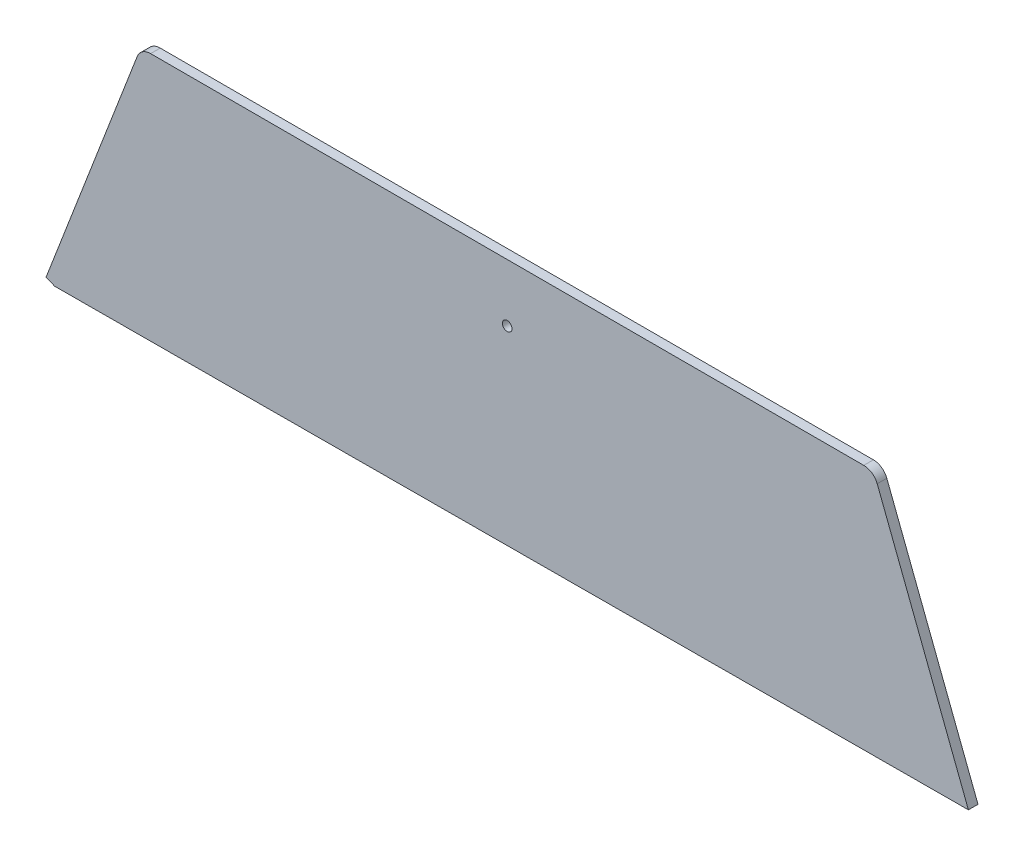
ISO-10303-21;
HEADER;
FILE_DESCRIPTION(('STEP AP214'),'2;1');
FILE_NAME('part.step','',(''),(''),'','','');
FILE_SCHEMA(('AUTOMOTIVE_DESIGN { 1 0 10303 214 1 1 1 1 }'));
ENDSEC;
DATA;
#1=APPLICATION_CONTEXT('core data for automotive mechanical design processes');
#2=APPLICATION_PROTOCOL_DEFINITION('international standard','automotive_design',2000,#1);
#3=PRODUCT_CONTEXT('',#1,'mechanical');
#4=PRODUCT('Part','Part','',(#3));
#5=PRODUCT_RELATED_PRODUCT_CATEGORY('part','',(#4));
#6=PRODUCT_DEFINITION_FORMATION('','',#4);
#7=PRODUCT_DEFINITION_CONTEXT('part definition',#1,'design');
#8=PRODUCT_DEFINITION('design','',#6,#7);
#9=PRODUCT_DEFINITION_SHAPE('','',#8);
#10=(LENGTH_UNIT() NAMED_UNIT(*) SI_UNIT(.MILLI.,.METRE.));
#11=(NAMED_UNIT(*) PLANE_ANGLE_UNIT() SI_UNIT($,.RADIAN.));
#12=(NAMED_UNIT(*) SI_UNIT($,.STERADIAN.) SOLID_ANGLE_UNIT());
#13=UNCERTAINTY_MEASURE_WITH_UNIT(LENGTH_MEASURE(1.E-05),#10,'distance_accuracy_value','');
#14=(GEOMETRIC_REPRESENTATION_CONTEXT(3) GLOBAL_UNCERTAINTY_ASSIGNED_CONTEXT((#13)) GLOBAL_UNIT_ASSIGNED_CONTEXT((#10,
#11,#12)) REPRESENTATION_CONTEXT('',''));
#15=CARTESIAN_POINT('',(0.,0.,0.));
#16=DIRECTION('',(0.,0.,1.));
#17=DIRECTION('',(1.,0.,0.));
#18=AXIS2_PLACEMENT_3D('',#15,#16,#17);
#19=CARTESIAN_POINT('',(0.192191810578057,-51.6310409561935,1.99999999999984));
#20=DIRECTION('',(-0.00372238241756845,0.99999307191059,0.));
#21=DIRECTION('',(-0.99999307191057,-0.0037223824175685,0.));
#22=AXIS2_PLACEMENT_3D('',#19,#20,#21);
#23=PLANE('',#22);
#24=DIRECTION('',(0.99999307191057,0.0037223824175685,0.));
#25=VECTOR('',#24,1.);
#26=CARTESIAN_POINT('',(0.192191810578279,-51.6310409561933,-3.33066907387547E-13));
#27=LINE('',#26,#25);
#28=CARTESIAN_POINT('',(-94.2947791369437,-51.9827600322786,0.));
#29=VERTEX_POINT('',#28);
#30=CARTESIAN_POINT('',(94.116450585674,-51.2814165245154,0.));
#31=VERTEX_POINT('',#30);
#32=EDGE_CURVE('E138',#29,#31,#27,.T.);
#33=ORIENTED_EDGE('',*,*,#32,.T.);
#34=DIRECTION('',(0.,0.,-1.));
#35=VECTOR('',#34,1.);
#36=CARTESIAN_POINT('',(94.116450585674,-51.2814165245166,2.00000000000039));
#37=LINE('',#36,#35);
#38=CARTESIAN_POINT('',(94.116450585674,-51.2814165245166,2.00000000000039));
#39=VERTEX_POINT('',#38);
#40=EDGE_CURVE('E11',#39,#31,#37,.T.);
#41=ORIENTED_EDGE('',*,*,#40,.F.);
#42=DIRECTION('',(0.99999307191057,0.0037223824175685,0.));
#43=VECTOR('',#42,1.);
#44=CARTESIAN_POINT('',(0.192191810578057,-51.6310409561935,1.99999999999984));
#45=LINE('',#44,#43);
#46=CARTESIAN_POINT('',(-94.2947791369437,-51.9827600322775,2.00000000000072));
#47=VERTEX_POINT('',#46);
#48=EDGE_CURVE('E157',#47,#39,#45,.T.);
#49=ORIENTED_EDGE('',*,*,#48,.F.);
#50=DIRECTION('',(0.,0.,-1.));
#51=VECTOR('',#50,1.);
#52=CARTESIAN_POINT('',(-94.2947791369437,-51.9827600322775,2.00000000000072));
#53=LINE('',#52,#51);
#54=EDGE_CURVE('E134',#47,#29,#53,.T.);
#55=ORIENTED_EDGE('',*,*,#54,.T.);
#56=EDGE_LOOP('',(#33,#41,#49,#55));
#57=FACE_BOUND('',#56,.T.);
#58=ADVANCED_FACE('F43',(#57),#23,.F.);
#59=CARTESIAN_POINT('',(-4.2632564145606E-11,-51.2814165244388,2.));
#60=DIRECTION('',(8.29185011133809E-13,1.00000000000002,0.));
#61=DIRECTION('',(-1.,8.29210631900104E-13,0.));
#62=AXIS2_PLACEMENT_3D('',#59,#60,#61);
#63=PLANE('',#62);
#64=DIRECTION('',(1.,-8.29210631900104E-13,0.));
#65=VECTOR('',#64,1.);
#66=CARTESIAN_POINT('',(-4.2410519540681E-11,-51.2814165244377,-1.66533453693773E-13));
#67=LINE('',#66,#65);
#68=CARTESIAN_POINT('',(96.1164505856742,-51.2814165245172,0.));
#69=VERTEX_POINT('',#68);
#70=EDGE_CURVE('E141',#31,#69,#67,.T.);
#71=ORIENTED_EDGE('',*,*,#70,.T.);
#72=DIRECTION('',(0.,0.,-1.));
#73=VECTOR('',#72,1.);
#74=CARTESIAN_POINT('',(96.116450585674,-51.2814165245179,1.99999999999995));
#75=LINE('',#74,#73);
#76=CARTESIAN_POINT('',(96.116450585674,-51.2814165245179,1.99999999999995));
#77=VERTEX_POINT('',#76);
#78=EDGE_CURVE('E52',#77,#69,#75,.T.);
#79=ORIENTED_EDGE('',*,*,#78,.F.);
#80=DIRECTION('',(1.,-8.29210631900104E-13,0.));
#81=VECTOR('',#80,1.);
#82=CARTESIAN_POINT('',(-4.2632564145606E-11,-51.2814165244388,2.));
#83=LINE('',#82,#81);
#84=EDGE_CURVE('E99',#39,#77,#83,.T.);
#85=ORIENTED_EDGE('',*,*,#84,.F.);
#86=ORIENTED_EDGE('',*,*,#40,.T.);
#87=EDGE_LOOP('',(#71,#79,#85,#86));
#88=FACE_BOUND('',#87,.T.);
#89=ADVANCED_FACE('F171',(#88),#63,.F.);
#90=CARTESIAN_POINT('',(66.5140588506031,25.6079126574832,2.00000000000022));
#91=DIRECTION('',(0.933225292836741,0.359291737742166,0.));
#92=DIRECTION('',(-0.359291737742159,0.933225292836759,0.));
#93=AXIS2_PLACEMENT_3D('',#90,#91,#92);
#94=PLANE('',#93);
#95=DIRECTION('',(0.359291737742159,-0.933225292836759,0.));
#96=VECTOR('',#95,1.);
#97=CARTESIAN_POINT('',(66.5140588506033,25.6079126574836,4.9960036108132E-13));
#98=LINE('',#97,#96);
#99=CARTESIAN_POINT('',(77.1131232666422,-1.92212478677542,8.32667268468867E-13));
#100=VERTEX_POINT('',#99);
#101=EDGE_CURVE('E144',#100,#69,#98,.T.);
#102=ORIENTED_EDGE('',*,*,#101,.F.);
#103=DIRECTION('',(0.,0.,-1.));
#104=VECTOR('',#103,1.);
#105=CARTESIAN_POINT('',(77.1131232666422,-1.92212478677382,2.00000000000083));
#106=LINE('',#105,#104);
#107=CARTESIAN_POINT('',(77.1131232666422,-1.92212478677382,2.00000000000083));
#108=VERTEX_POINT('',#107);
#109=EDGE_CURVE('E163',#108,#100,#106,.T.);
#110=ORIENTED_EDGE('',*,*,#109,.F.);
#111=DIRECTION('',(0.359291737742159,-0.933225292836759,0.));
#112=VECTOR('',#111,1.);
#113=CARTESIAN_POINT('',(66.5140588506031,25.6079126574832,2.00000000000022));
#114=LINE('',#113,#112);
#115=EDGE_CURVE('E170',#108,#77,#114,.T.);
#116=ORIENTED_EDGE('',*,*,#115,.T.);
#117=ORIENTED_EDGE('',*,*,#78,.T.);
#118=EDGE_LOOP('',(#102,#110,#116,#117));
#119=FACE_BOUND('',#118,.T.);
#120=ADVANCED_FACE('F168',(#119),#94,.T.);
#121=CARTESIAN_POINT('',(74.3134473881319,-3.0000000000022,2.00000000000078));
#122=DIRECTION('',(0.,0.,-1.));
#123=DIRECTION('',(-1.,0.,0.));
#124=AXIS2_PLACEMENT_3D('',#121,#122,#123);
#125=CYLINDRICAL_SURFACE('',#124,3.00000000000017);
#126=CARTESIAN_POINT('',(74.3134473881322,-3.00000000000175,6.10622663543836E-13));
#127=DIRECTION('',(0.,0.,1.));
#128=DIRECTION('',(1.,0.,0.));
#129=AXIS2_PLACEMENT_3D('',#126,#127,#128);
#130=CIRCLE('',#129,3.00000000000017);
#131=CARTESIAN_POINT('',(74.3134473881322,0.,7.7715611723761E-13));
#132=VERTEX_POINT('',#131);
#133=EDGE_CURVE('E147',#100,#132,#130,.T.);
#134=ORIENTED_EDGE('',*,*,#133,.T.);
#135=DIRECTION('',(0.,0.,-1.));
#136=VECTOR('',#135,1.);
#137=CARTESIAN_POINT('',(74.3134473881319,1.2490009027033E-12,2.00000000000122));
#138=LINE('',#137,#136);
#139=CARTESIAN_POINT('',(74.3134473881319,1.2490009027033E-12,2.00000000000122));
#140=VERTEX_POINT('',#139);
#141=EDGE_CURVE('E161',#140,#132,#138,.T.);
#142=ORIENTED_EDGE('',*,*,#141,.F.);
#143=CARTESIAN_POINT('',(74.3134473881319,-3.0000000000022,2.00000000000078));
#144=DIRECTION('',(0.,0.,1.));
#145=DIRECTION('',(1.,0.,0.));
#146=AXIS2_PLACEMENT_3D('',#143,#144,#145);
#147=CIRCLE('',#146,3.00000000000017);
#148=EDGE_CURVE('E182',#108,#140,#147,.T.);
#149=ORIENTED_EDGE('',*,*,#148,.F.);
#150=ORIENTED_EDGE('',*,*,#109,.T.);
#151=EDGE_LOOP('',(#134,#142,#149,#150));
#152=FACE_BOUND('',#151,.T.);
#153=ADVANCED_FACE('F180',(#152),#125,.T.);
#154=CARTESIAN_POINT('',(0.,1.76247905159244E-12,2.00000000000022));
#155=DIRECTION('',(0.,1.00000000000002,0.));
#156=DIRECTION('',(-1.,0.,0.));
#157=AXIS2_PLACEMENT_3D('',#154,#155,#156);
#158=PLANE('',#157);
#159=DIRECTION('',(1.,0.,0.));
#160=VECTOR('',#159,1.);
#161=CARTESIAN_POINT('',(0.,0.,0.));
#162=LINE('',#161,#160);
#163=CARTESIAN_POINT('',(-74.3134473881328,0.,4.44089209850063E-13));
#164=VERTEX_POINT('',#163);
#165=EDGE_CURVE('E150',#164,#132,#162,.T.);
#166=ORIENTED_EDGE('',*,*,#165,.F.);
#167=DIRECTION('',(0.,0.,-1.));
#168=VECTOR('',#167,1.);
#169=CARTESIAN_POINT('',(-74.3134473881328,1.12410081243297E-12,2.00000000000061));
#170=LINE('',#169,#168);
#171=CARTESIAN_POINT('',(-74.3134473881328,1.12410081243297E-12,2.00000000000061));
#172=VERTEX_POINT('',#171);
#173=EDGE_CURVE('E124',#172,#164,#170,.T.);
#174=ORIENTED_EDGE('',*,*,#173,.F.);
#175=DIRECTION('',(1.,0.,0.));
#176=VECTOR('',#175,1.);
#177=CARTESIAN_POINT('',(0.,1.76247905159244E-12,2.00000000000022));
#178=LINE('',#177,#176);
#179=EDGE_CURVE('E130',#172,#140,#178,.T.);
#180=ORIENTED_EDGE('',*,*,#179,.T.);
#181=ORIENTED_EDGE('',*,*,#141,.T.);
#182=EDGE_LOOP('',(#166,#174,#180,#181));
#183=FACE_BOUND('',#182,.T.);
#184=ADVANCED_FACE('F188',(#183),#158,.T.);
#185=CARTESIAN_POINT('',(-74.3134473881326,-3.00000000000196,2.00000000000045));
#186=DIRECTION('',(0.,0.,-1.));
#187=DIRECTION('',(-1.,0.,0.));
#188=AXIS2_PLACEMENT_3D('',#185,#186,#187);
#189=CYLINDRICAL_SURFACE('',#188,3.00000000000009);
#190=CARTESIAN_POINT('',(-74.3134473881326,-3.00000000000196,3.33066907387547E-13));
#191=DIRECTION('',(0.,0.,1.));
#192=DIRECTION('',(1.,0.,0.));
#193=AXIS2_PLACEMENT_3D('',#190,#191,#192);
#194=CIRCLE('',#193,3.00000000000009);
#195=CARTESIAN_POINT('',(-77.1131232666431,-1.92212478677539,0.));
#196=VERTEX_POINT('',#195);
#197=EDGE_CURVE('E119',#196,#164,#194,.F.);
#198=ORIENTED_EDGE('',*,*,#197,.F.);
#199=DIRECTION('',(0.,0.,-1.));
#200=VECTOR('',#199,1.);
#201=CARTESIAN_POINT('',(-77.1131232666431,-1.92212478677317,2.00000000000033));
#202=LINE('',#201,#200);
#203=CARTESIAN_POINT('',(-77.1131232666431,-1.92212478677317,2.00000000000033));
#204=VERTEX_POINT('',#203);
#205=EDGE_CURVE('E114',#204,#196,#202,.T.);
#206=ORIENTED_EDGE('',*,*,#205,.F.);
#207=CARTESIAN_POINT('',(-74.3134473881326,-3.00000000000196,2.00000000000045));
#208=DIRECTION('',(0.,0.,1.));
#209=DIRECTION('',(1.,0.,0.));
#210=AXIS2_PLACEMENT_3D('',#207,#208,#209);
#211=CIRCLE('',#210,3.00000000000009);
#212=EDGE_CURVE('E117',#204,#172,#211,.F.);
#213=ORIENTED_EDGE('',*,*,#212,.T.);
#214=ORIENTED_EDGE('',*,*,#173,.T.);
#215=EDGE_LOOP('',(#198,#206,#213,#214));
#216=FACE_BOUND('',#215,.T.);
#217=ADVANCED_FACE('F116',(#216),#189,.T.);
#218=CARTESIAN_POINT('',(-66.5140588506039,25.6079126574832,2.00000000000017));
#219=DIRECTION('',(-0.933225292836741,0.359291737742162,0.));
#220=DIRECTION('',(-0.359291737742154,-0.933225292836762,0.));
#221=AXIS2_PLACEMENT_3D('',#218,#219,#220);
#222=PLANE('',#221);
#223=DIRECTION('',(0.359291737742154,0.933225292836762,0.));
#224=VECTOR('',#223,1.);
#225=CARTESIAN_POINT('',(-66.5140588506039,25.6079126574837,8.88178419700125E-13));
#226=LINE('',#225,#224);
#227=CARTESIAN_POINT('',(-96.1164505856737,-51.2814165245165,5.55111512312578E-13));
#228=VERTEX_POINT('',#227);
#229=EDGE_CURVE('E154',#228,#196,#226,.T.);
#230=ORIENTED_EDGE('',*,*,#229,.F.);
#231=DIRECTION('',(0.,0.,-1.));
#232=VECTOR('',#231,1.);
#233=CARTESIAN_POINT('',(-96.1164505856742,-51.2814165245174,2.00000000000083));
#234=LINE('',#233,#232);
#235=CARTESIAN_POINT('',(-96.1164505856742,-51.2814165245174,2.00000000000083));
#236=VERTEX_POINT('',#235);
#237=EDGE_CURVE('E88',#236,#228,#234,.T.);
#238=ORIENTED_EDGE('',*,*,#237,.F.);
#239=DIRECTION('',(0.359291737742154,0.933225292836762,0.));
#240=VECTOR('',#239,1.);
#241=CARTESIAN_POINT('',(-66.5140588506039,25.6079126574832,2.00000000000017));
#242=LINE('',#241,#240);
#243=EDGE_CURVE('E128',#236,#204,#242,.T.);
#244=ORIENTED_EDGE('',*,*,#243,.T.);
#245=ORIENTED_EDGE('',*,*,#205,.T.);
#246=EDGE_LOOP('',(#230,#238,#244,#245));
#247=FACE_BOUND('',#246,.T.);
#248=ADVANCED_FACE('F132',(#247),#222,.T.);
#249=CARTESIAN_POINT('',(-29.6023917350816,-76.8893291820055,2.00000000000011));
#250=DIRECTION('',(0.359291737742259,0.933225292836723,0.));
#251=DIRECTION('',(-0.933225292836701,0.359291737742266,0.));
#252=AXIS2_PLACEMENT_3D('',#249,#250,#251);
#253=PLANE('',#252);
#254=DIRECTION('',(0.933225292836701,-0.359291737742266,0.));
#255=VECTOR('',#254,1.);
#256=CARTESIAN_POINT('',(-29.6023917350816,-76.8893291820046,3.33066907387547E-13));
#257=LINE('',#256,#255);
#258=EDGE_CURVE('E91',#228,#29,#257,.T.);
#259=ORIENTED_EDGE('',*,*,#258,.T.);
#260=ORIENTED_EDGE('',*,*,#54,.F.);
#261=DIRECTION('',(0.933225292836701,-0.359291737742266,0.));
#262=VECTOR('',#261,1.);
#263=CARTESIAN_POINT('',(-29.6023917350816,-76.8893291820055,2.00000000000011));
#264=LINE('',#263,#262);
#265=EDGE_CURVE('E60',#236,#47,#264,.T.);
#266=ORIENTED_EDGE('',*,*,#265,.F.);
#267=ORIENTED_EDGE('',*,*,#237,.T.);
#268=EDGE_LOOP('',(#259,#260,#266,#267));
#269=FACE_BOUND('',#268,.T.);
#270=ADVANCED_FACE('F191',(#269),#253,.F.);
#271=CARTESIAN_POINT('',(0.,1.76247905159244E-12,2.00000000000022));
#272=DIRECTION('',(0.,0.,1.));
#273=DIRECTION('',(1.,0.,0.));
#274=AXIS2_PLACEMENT_3D('',#271,#272,#273);
#275=PLANE('',#274);
#276=CARTESIAN_POINT('',(0.,-12.0000000000001,2.00000000000028));
#277=DIRECTION('',(0.,0.,1.));
#278=DIRECTION('',(1.,0.,0.));
#279=AXIS2_PLACEMENT_3D('',#276,#277,#278);
#280=CIRCLE('',#279,1.);
#281=CARTESIAN_POINT('',(1.,-12.0000000000001,2.00000000000028));
#282=VERTEX_POINT('',#281);
#283=EDGE_CURVE('E257',#282,#282,#280,.T.);
#284=ORIENTED_EDGE('',*,*,#283,.F.);
#285=EDGE_LOOP('',(#284));
#286=FACE_BOUND('',#285,.T.);
#287=ORIENTED_EDGE('',*,*,#48,.T.);
#288=ORIENTED_EDGE('',*,*,#84,.T.);
#289=ORIENTED_EDGE('',*,*,#115,.F.);
#290=ORIENTED_EDGE('',*,*,#148,.T.);
#291=ORIENTED_EDGE('',*,*,#179,.F.);
#292=ORIENTED_EDGE('',*,*,#212,.F.);
#293=ORIENTED_EDGE('',*,*,#243,.F.);
#294=ORIENTED_EDGE('',*,*,#265,.T.);
#295=EDGE_LOOP('',(#287,#288,#289,#290,#291,#292,#293,#294));
#296=FACE_BOUND('',#295,.T.);
#297=ADVANCED_FACE('F127',(#286,#296),#275,.T.);
#298=CARTESIAN_POINT('',(0.,0.,0.));
#299=DIRECTION('',(0.,0.,1.));
#300=DIRECTION('',(1.,0.,0.));
#301=AXIS2_PLACEMENT_3D('',#298,#299,#300);
#302=PLANE('',#301);
#303=CARTESIAN_POINT('',(0.,-12.0000000000006,1.11022302462516E-13));
#304=DIRECTION('',(0.,0.,1.));
#305=DIRECTION('',(1.,0.,0.));
#306=AXIS2_PLACEMENT_3D('',#303,#304,#305);
#307=CIRCLE('',#306,1.);
#308=CARTESIAN_POINT('',(1.,-12.0000000000006,1.11021158329459E-13));
#309=VERTEX_POINT('',#308);
#310=EDGE_CURVE('E46',#309,#309,#307,.T.);
#311=ORIENTED_EDGE('',*,*,#310,.T.);
#312=EDGE_LOOP('',(#311));
#313=FACE_BOUND('',#312,.T.);
#314=ORIENTED_EDGE('',*,*,#32,.F.);
#315=ORIENTED_EDGE('',*,*,#258,.F.);
#316=ORIENTED_EDGE('',*,*,#229,.T.);
#317=ORIENTED_EDGE('',*,*,#197,.T.);
#318=ORIENTED_EDGE('',*,*,#165,.T.);
#319=ORIENTED_EDGE('',*,*,#133,.F.);
#320=ORIENTED_EDGE('',*,*,#101,.T.);
#321=ORIENTED_EDGE('',*,*,#70,.F.);
#322=EDGE_LOOP('',(#314,#315,#316,#317,#318,#319,#320,#321));
#323=FACE_BOUND('',#322,.T.);
#324=ADVANCED_FACE('F176',(#313,#323),#302,.F.);
#325=CARTESIAN_POINT('',(0.,-12.0000000000016,-7.99999999999984));
#326=DIRECTION('',(0.,0.,1.));
#327=DIRECTION('',(1.,0.,0.));
#328=AXIS2_PLACEMENT_3D('',#325,#326,#327);
#329=CYLINDRICAL_SURFACE('',#328,1.);
#330=ORIENTED_EDGE('',*,*,#283,.T.);
#331=EDGE_LOOP('',(#330));
#332=FACE_BOUND('',#331,.T.);
#333=ORIENTED_EDGE('',*,*,#310,.F.);
#334=EDGE_LOOP('',(#333));
#335=FACE_BOUND('',#334,.T.);
#336=ADVANCED_FACE('F242',(#332,#335),#329,.F.);
#337=CLOSED_SHELL('',(#58,#89,#120,#153,#184,#217,#248,#270,#297,#324,#336));
#338=MANIFOLD_SOLID_BREP('B2',#337);
#339=ADVANCED_BREP_SHAPE_REPRESENTATION('',(#18,#338),#14);
#340=SHAPE_DEFINITION_REPRESENTATION(#9,#339);
ENDSEC;
END-ISO-10303-21;
